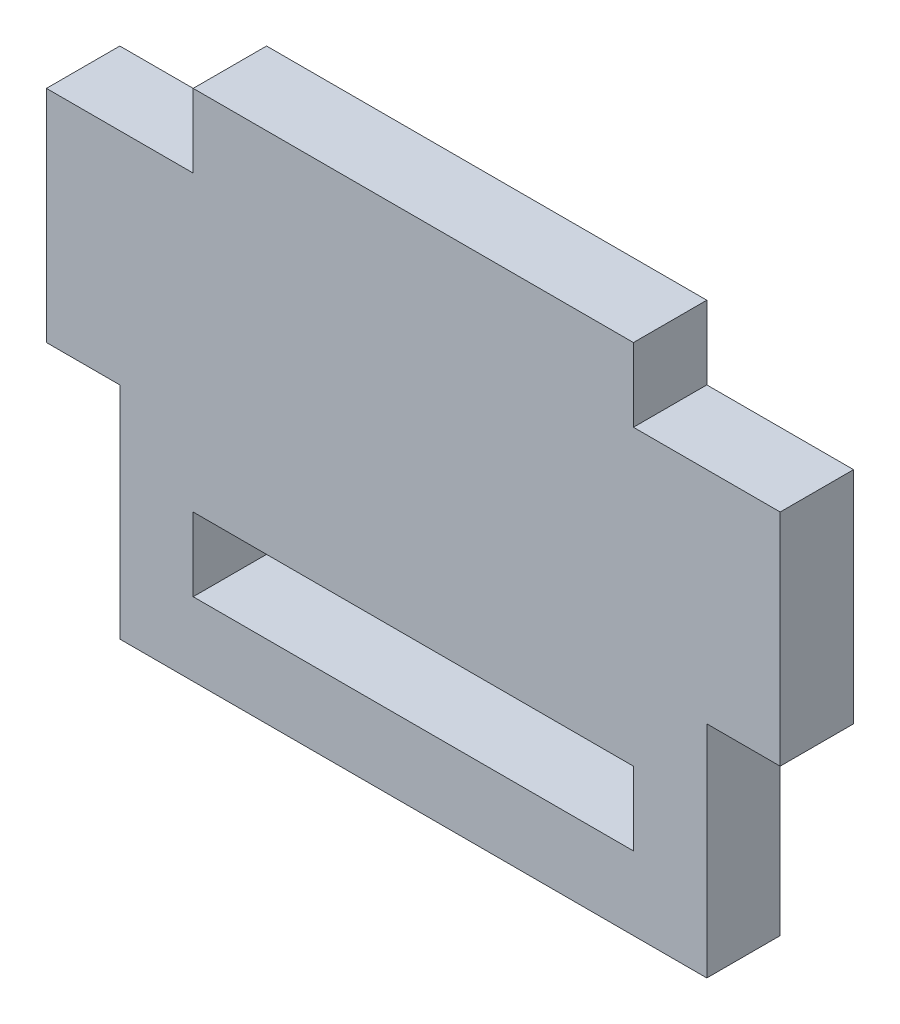
ISO-10303-21;
HEADER;
FILE_DESCRIPTION(('STEP AP214'),'2;1');
FILE_NAME('part.step','',(''),(''),'','','');
FILE_SCHEMA(('AUTOMOTIVE_DESIGN { 1 0 10303 214 1 1 1 1 }'));
ENDSEC;
DATA;
#1=APPLICATION_CONTEXT('core data for automotive mechanical design processes');
#2=APPLICATION_PROTOCOL_DEFINITION('international standard','automotive_design',2000,#1);
#3=PRODUCT_CONTEXT('',#1,'mechanical');
#4=PRODUCT('Part','Part','',(#3));
#5=PRODUCT_RELATED_PRODUCT_CATEGORY('part','',(#4));
#6=PRODUCT_DEFINITION_FORMATION('','',#4);
#7=PRODUCT_DEFINITION_CONTEXT('part definition',#1,'design');
#8=PRODUCT_DEFINITION('design','',#6,#7);
#9=PRODUCT_DEFINITION_SHAPE('','',#8);
#10=(LENGTH_UNIT() NAMED_UNIT(*) SI_UNIT(.MILLI.,.METRE.));
#11=(NAMED_UNIT(*) PLANE_ANGLE_UNIT() SI_UNIT($,.RADIAN.));
#12=(NAMED_UNIT(*) SI_UNIT($,.STERADIAN.) SOLID_ANGLE_UNIT());
#13=UNCERTAINTY_MEASURE_WITH_UNIT(LENGTH_MEASURE(1.E-05),#10,'distance_accuracy_value','');
#14=(GEOMETRIC_REPRESENTATION_CONTEXT(3) GLOBAL_UNCERTAINTY_ASSIGNED_CONTEXT((#13)) GLOBAL_UNIT_ASSIGNED_CONTEXT((#10,
#11,#12)) REPRESENTATION_CONTEXT('',''));
#15=CARTESIAN_POINT('',(0.,0.,0.));
#16=DIRECTION('',(0.,0.,1.));
#17=DIRECTION('',(1.,0.,0.));
#18=AXIS2_PLACEMENT_3D('',#15,#16,#17);
#19=CARTESIAN_POINT('',(0.,-20.,5.));
#20=DIRECTION('',(0.,1.,0.));
#21=DIRECTION('',(0.,0.,1.));
#22=AXIS2_PLACEMENT_3D('',#19,#20,#21);
#23=PLANE('',#22);
#24=DIRECTION('',(1.,0.,0.));
#25=VECTOR('',#24,1.);
#26=CARTESIAN_POINT('',(0.,-20.,0.));
#27=LINE('',#26,#25);
#28=CARTESIAN_POINT('',(10.,-20.,0.));
#29=VERTEX_POINT('',#28);
#30=CARTESIAN_POINT('',(40.,-20.,0.));
#31=VERTEX_POINT('',#30);
#32=EDGE_CURVE('E207',#29,#31,#27,.T.);
#33=ORIENTED_EDGE('',*,*,#32,.T.);
#34=DIRECTION('',(0.,0.,-1.));
#35=VECTOR('',#34,1.);
#36=CARTESIAN_POINT('',(40.,-20.,5.));
#37=LINE('',#36,#35);
#38=CARTESIAN_POINT('',(40.,-20.,5.));
#39=VERTEX_POINT('',#38);
#40=EDGE_CURVE('E11',#39,#31,#37,.T.);
#41=ORIENTED_EDGE('',*,*,#40,.F.);
#42=DIRECTION('',(1.,0.,0.));
#43=VECTOR('',#42,1.);
#44=CARTESIAN_POINT('',(0.,-20.,5.));
#45=LINE('',#44,#43);
#46=CARTESIAN_POINT('',(10.,-20.,5.));
#47=VERTEX_POINT('',#46);
#48=EDGE_CURVE('E161',#47,#39,#45,.T.);
#49=ORIENTED_EDGE('',*,*,#48,.F.);
#50=DIRECTION('',(0.,0.,-1.));
#51=VECTOR('',#50,1.);
#52=CARTESIAN_POINT('',(10.,-20.,5.));
#53=LINE('',#52,#51);
#54=EDGE_CURVE('E53',#47,#29,#53,.T.);
#55=ORIENTED_EDGE('',*,*,#54,.T.);
#56=EDGE_LOOP('',(#33,#41,#49,#55));
#57=FACE_BOUND('',#56,.T.);
#58=ADVANCED_FACE('F34',(#57),#23,.F.);
#59=CARTESIAN_POINT('',(40.,0.,5.));
#60=DIRECTION('',(1.,0.,0.));
#61=DIRECTION('',(0.,0.,-1.));
#62=AXIS2_PLACEMENT_3D('',#59,#60,#61);
#63=PLANE('',#62);
#64=DIRECTION('',(0.,-1.,0.));
#65=VECTOR('',#64,1.);
#66=CARTESIAN_POINT('',(40.,0.,0.));
#67=LINE('',#66,#65);
#68=CARTESIAN_POINT('',(40.,-25.,0.));
#69=VERTEX_POINT('',#68);
#70=EDGE_CURVE('E167',#31,#69,#67,.T.);
#71=ORIENTED_EDGE('',*,*,#70,.T.);
#72=DIRECTION('',(0.,0.,-1.));
#73=VECTOR('',#72,1.);
#74=CARTESIAN_POINT('',(40.,-25.,5.));
#75=LINE('',#74,#73);
#76=CARTESIAN_POINT('',(40.,-25.,5.));
#77=VERTEX_POINT('',#76);
#78=EDGE_CURVE('E44',#77,#69,#75,.T.);
#79=ORIENTED_EDGE('',*,*,#78,.F.);
#80=DIRECTION('',(0.,-1.,0.));
#81=VECTOR('',#80,1.);
#82=CARTESIAN_POINT('',(40.,0.,5.));
#83=LINE('',#82,#81);
#84=EDGE_CURVE('E155',#39,#77,#83,.T.);
#85=ORIENTED_EDGE('',*,*,#84,.F.);
#86=ORIENTED_EDGE('',*,*,#40,.T.);
#87=EDGE_LOOP('',(#71,#79,#85,#86));
#88=FACE_BOUND('',#87,.T.);
#89=ADVANCED_FACE('F166',(#88),#63,.F.);
#90=CARTESIAN_POINT('',(0.,-25.,5.));
#91=DIRECTION('',(0.,1.,0.));
#92=DIRECTION('',(-1.,0.,0.));
#93=AXIS2_PLACEMENT_3D('',#90,#91,#92);
#94=PLANE('',#93);
#95=DIRECTION('',(1.,0.,0.));
#96=VECTOR('',#95,1.);
#97=CARTESIAN_POINT('',(0.,-25.,0.));
#98=LINE('',#97,#96);
#99=CARTESIAN_POINT('',(10.,-25.,0.));
#100=VERTEX_POINT('',#99);
#101=EDGE_CURVE('E210',#100,#69,#98,.T.);
#102=ORIENTED_EDGE('',*,*,#101,.F.);
#103=DIRECTION('',(0.,0.,-1.));
#104=VECTOR('',#103,1.);
#105=CARTESIAN_POINT('',(10.,-25.,5.));
#106=LINE('',#105,#104);
#107=CARTESIAN_POINT('',(10.,-25.,5.));
#108=VERTEX_POINT('',#107);
#109=EDGE_CURVE('E103',#108,#100,#106,.T.);
#110=ORIENTED_EDGE('',*,*,#109,.F.);
#111=DIRECTION('',(1.,0.,0.));
#112=VECTOR('',#111,1.);
#113=CARTESIAN_POINT('',(0.,-25.,5.));
#114=LINE('',#113,#112);
#115=EDGE_CURVE('E160',#108,#77,#114,.T.);
#116=ORIENTED_EDGE('',*,*,#115,.T.);
#117=ORIENTED_EDGE('',*,*,#78,.T.);
#118=EDGE_LOOP('',(#102,#110,#116,#117));
#119=FACE_BOUND('',#118,.T.);
#120=ADVANCED_FACE('F171',(#119),#94,.T.);
#121=CARTESIAN_POINT('',(10.,0.,5.));
#122=DIRECTION('',(-1.,0.,0.));
#123=DIRECTION('',(0.,-1.,0.));
#124=AXIS2_PLACEMENT_3D('',#121,#122,#123);
#125=PLANE('',#124);
#126=DIRECTION('',(0.,1.,0.));
#127=VECTOR('',#126,1.);
#128=CARTESIAN_POINT('',(10.,0.,0.));
#129=LINE('',#128,#127);
#130=CARTESIAN_POINT('',(10.,0.,0.));
#131=VERTEX_POINT('',#130);
#132=CARTESIAN_POINT('',(10.,5.,0.));
#133=VERTEX_POINT('',#132);
#134=EDGE_CURVE('E178',#131,#133,#129,.T.);
#135=ORIENTED_EDGE('',*,*,#134,.F.);
#136=DIRECTION('',(0.,0.,-1.));
#137=VECTOR('',#136,1.);
#138=CARTESIAN_POINT('',(10.,0.,5.));
#139=LINE('',#138,#137);
#140=CARTESIAN_POINT('',(10.,0.,5.));
#141=VERTEX_POINT('',#140);
#142=EDGE_CURVE('E38',#141,#131,#139,.T.);
#143=ORIENTED_EDGE('',*,*,#142,.F.);
#144=DIRECTION('',(0.,1.,0.));
#145=VECTOR('',#144,1.);
#146=CARTESIAN_POINT('',(10.,0.,5.));
#147=LINE('',#146,#145);
#148=CARTESIAN_POINT('',(10.,5.,5.));
#149=VERTEX_POINT('',#148);
#150=EDGE_CURVE('E215',#141,#149,#147,.T.);
#151=ORIENTED_EDGE('',*,*,#150,.T.);
#152=DIRECTION('',(0.,0.,-1.));
#153=VECTOR('',#152,1.);
#154=CARTESIAN_POINT('',(10.,5.,5.));
#155=LINE('',#154,#153);
#156=EDGE_CURVE('E174',#149,#133,#155,.T.);
#157=ORIENTED_EDGE('',*,*,#156,.T.);
#158=EDGE_LOOP('',(#135,#143,#151,#157));
#159=FACE_BOUND('',#158,.T.);
#160=ADVANCED_FACE('F36',(#159),#125,.T.);
#161=CARTESIAN_POINT('',(0.,0.,5.));
#162=DIRECTION('',(0.,1.,0.));
#163=DIRECTION('',(-1.,0.,0.));
#164=AXIS2_PLACEMENT_3D('',#161,#162,#163);
#165=PLANE('',#164);
#166=DIRECTION('',(1.,0.,0.));
#167=VECTOR('',#166,1.);
#168=CARTESIAN_POINT('',(0.,0.,0.));
#169=LINE('',#168,#167);
#170=CARTESIAN_POINT('',(0.,0.,0.));
#171=VERTEX_POINT('',#170);
#172=EDGE_CURVE('E181',#171,#131,#169,.T.);
#173=ORIENTED_EDGE('',*,*,#172,.F.);
#174=DIRECTION('',(0.,0.,-1.));
#175=VECTOR('',#174,1.);
#176=CARTESIAN_POINT('',(0.,0.,5.));
#177=LINE('',#176,#175);
#178=CARTESIAN_POINT('',(0.,0.,5.));
#179=VERTEX_POINT('',#178);
#180=EDGE_CURVE('E239',#179,#171,#177,.T.);
#181=ORIENTED_EDGE('',*,*,#180,.F.);
#182=DIRECTION('',(1.,0.,0.));
#183=VECTOR('',#182,1.);
#184=CARTESIAN_POINT('',(0.,0.,5.));
#185=LINE('',#184,#183);
#186=EDGE_CURVE('E248',#179,#141,#185,.T.);
#187=ORIENTED_EDGE('',*,*,#186,.T.);
#188=ORIENTED_EDGE('',*,*,#142,.T.);
#189=EDGE_LOOP('',(#173,#181,#187,#188));
#190=FACE_BOUND('',#189,.T.);
#191=ADVANCED_FACE('F246',(#190),#165,.T.);
#192=CARTESIAN_POINT('',(0.,0.,5.));
#193=DIRECTION('',(1.,0.,0.));
#194=DIRECTION('',(0.,1.,0.));
#195=AXIS2_PLACEMENT_3D('',#192,#193,#194);
#196=PLANE('',#195);
#197=DIRECTION('',(0.,-1.,0.));
#198=VECTOR('',#197,1.);
#199=CARTESIAN_POINT('',(0.,0.,0.));
#200=LINE('',#199,#198);
#201=CARTESIAN_POINT('',(0.,-15.,0.));
#202=VERTEX_POINT('',#201);
#203=EDGE_CURVE('E184',#171,#202,#200,.T.);
#204=ORIENTED_EDGE('',*,*,#203,.T.);
#205=DIRECTION('',(0.,0.,-1.));
#206=VECTOR('',#205,1.);
#207=CARTESIAN_POINT('',(0.,-15.,5.));
#208=LINE('',#207,#206);
#209=CARTESIAN_POINT('',(0.,-15.,5.));
#210=VERTEX_POINT('',#209);
#211=EDGE_CURVE('E237',#210,#202,#208,.T.);
#212=ORIENTED_EDGE('',*,*,#211,.F.);
#213=DIRECTION('',(0.,-1.,0.));
#214=VECTOR('',#213,1.);
#215=CARTESIAN_POINT('',(0.,0.,5.));
#216=LINE('',#215,#214);
#217=EDGE_CURVE('E265',#179,#210,#216,.T.);
#218=ORIENTED_EDGE('',*,*,#217,.F.);
#219=ORIENTED_EDGE('',*,*,#180,.T.);
#220=EDGE_LOOP('',(#204,#212,#218,#219));
#221=FACE_BOUND('',#220,.T.);
#222=ADVANCED_FACE('F256',(#221),#196,.F.);
#223=CARTESIAN_POINT('',(0.,-15.,5.));
#224=DIRECTION('',(0.,1.,0.));
#225=DIRECTION('',(0.,0.,1.));
#226=AXIS2_PLACEMENT_3D('',#223,#224,#225);
#227=PLANE('',#226);
#228=DIRECTION('',(1.,0.,0.));
#229=VECTOR('',#228,1.);
#230=CARTESIAN_POINT('',(0.,-15.,0.));
#231=LINE('',#230,#229);
#232=CARTESIAN_POINT('',(5.00000000000001,-15.,0.));
#233=VERTEX_POINT('',#232);
#234=EDGE_CURVE('E187',#202,#233,#231,.T.);
#235=ORIENTED_EDGE('',*,*,#234,.T.);
#236=DIRECTION('',(0.,0.,-1.));
#237=VECTOR('',#236,1.);
#238=CARTESIAN_POINT('',(5.00000000000001,-15.,5.));
#239=LINE('',#238,#237);
#240=CARTESIAN_POINT('',(5.00000000000001,-15.,5.));
#241=VERTEX_POINT('',#240);
#242=EDGE_CURVE('E234',#241,#233,#239,.T.);
#243=ORIENTED_EDGE('',*,*,#242,.F.);
#244=DIRECTION('',(1.,0.,0.));
#245=VECTOR('',#244,1.);
#246=CARTESIAN_POINT('',(0.,-15.,5.));
#247=LINE('',#246,#245);
#248=EDGE_CURVE('E261',#210,#241,#247,.T.);
#249=ORIENTED_EDGE('',*,*,#248,.F.);
#250=ORIENTED_EDGE('',*,*,#211,.T.);
#251=EDGE_LOOP('',(#235,#243,#249,#250));
#252=FACE_BOUND('',#251,.T.);
#253=ADVANCED_FACE('F259',(#252),#227,.F.);
#254=CARTESIAN_POINT('',(5.,0.,5.));
#255=DIRECTION('',(1.,0.,0.));
#256=DIRECTION('',(0.,1.,0.));
#257=AXIS2_PLACEMENT_3D('',#254,#255,#256);
#258=PLANE('',#257);
#259=DIRECTION('',(0.,-1.,0.));
#260=VECTOR('',#259,1.);
#261=CARTESIAN_POINT('',(5.,0.,0.));
#262=LINE('',#261,#260);
#263=CARTESIAN_POINT('',(5.00000000000001,-30.,0.));
#264=VERTEX_POINT('',#263);
#265=EDGE_CURVE('E189',#233,#264,#262,.T.);
#266=ORIENTED_EDGE('',*,*,#265,.T.);
#267=DIRECTION('',(0.,0.,-1.));
#268=VECTOR('',#267,1.);
#269=CARTESIAN_POINT('',(5.00000000000001,-30.,5.));
#270=LINE('',#269,#268);
#271=CARTESIAN_POINT('',(5.00000000000001,-30.,5.));
#272=VERTEX_POINT('',#271);
#273=EDGE_CURVE('E231',#272,#264,#270,.T.);
#274=ORIENTED_EDGE('',*,*,#273,.F.);
#275=DIRECTION('',(0.,-1.,0.));
#276=VECTOR('',#275,1.);
#277=CARTESIAN_POINT('',(5.,0.,5.));
#278=LINE('',#277,#276);
#279=EDGE_CURVE('E264',#241,#272,#278,.T.);
#280=ORIENTED_EDGE('',*,*,#279,.F.);
#281=ORIENTED_EDGE('',*,*,#242,.T.);
#282=EDGE_LOOP('',(#266,#274,#280,#281));
#283=FACE_BOUND('',#282,.T.);
#284=ADVANCED_FACE('F318',(#283),#258,.F.);
#285=CARTESIAN_POINT('',(0.,-30.,5.));
#286=DIRECTION('',(0.,1.,0.));
#287=DIRECTION('',(0.,0.,1.));
#288=AXIS2_PLACEMENT_3D('',#285,#286,#287);
#289=PLANE('',#288);
#290=DIRECTION('',(1.,0.,0.));
#291=VECTOR('',#290,1.);
#292=CARTESIAN_POINT('',(0.,-30.,0.));
#293=LINE('',#292,#291);
#294=CARTESIAN_POINT('',(45.,-30.,0.));
#295=VERTEX_POINT('',#294);
#296=EDGE_CURVE('E192',#264,#295,#293,.T.);
#297=ORIENTED_EDGE('',*,*,#296,.T.);
#298=DIRECTION('',(0.,0.,-1.));
#299=VECTOR('',#298,1.);
#300=CARTESIAN_POINT('',(45.,-30.,5.));
#301=LINE('',#300,#299);
#302=CARTESIAN_POINT('',(45.,-30.,5.));
#303=VERTEX_POINT('',#302);
#304=EDGE_CURVE('E229',#303,#295,#301,.T.);
#305=ORIENTED_EDGE('',*,*,#304,.F.);
#306=DIRECTION('',(1.,0.,0.));
#307=VECTOR('',#306,1.);
#308=CARTESIAN_POINT('',(0.,-30.,5.));
#309=LINE('',#308,#307);
#310=EDGE_CURVE('E268',#272,#303,#309,.T.);
#311=ORIENTED_EDGE('',*,*,#310,.F.);
#312=ORIENTED_EDGE('',*,*,#273,.T.);
#313=EDGE_LOOP('',(#297,#305,#311,#312));
#314=FACE_BOUND('',#313,.T.);
#315=ADVANCED_FACE('F315',(#314),#289,.F.);
#316=CARTESIAN_POINT('',(45.,0.,5.));
#317=DIRECTION('',(1.,0.,0.));
#318=DIRECTION('',(0.,1.,0.));
#319=AXIS2_PLACEMENT_3D('',#316,#317,#318);
#320=PLANE('',#319);
#321=DIRECTION('',(0.,-1.,0.));
#322=VECTOR('',#321,1.);
#323=CARTESIAN_POINT('',(45.,0.,0.));
#324=LINE('',#323,#322);
#325=CARTESIAN_POINT('',(45.,-15.,0.));
#326=VERTEX_POINT('',#325);
#327=EDGE_CURVE('E195',#326,#295,#324,.T.);
#328=ORIENTED_EDGE('',*,*,#327,.F.);
#329=DIRECTION('',(0.,0.,-1.));
#330=VECTOR('',#329,1.);
#331=CARTESIAN_POINT('',(45.,-15.,5.));
#332=LINE('',#331,#330);
#333=CARTESIAN_POINT('',(45.,-15.,5.));
#334=VERTEX_POINT('',#333);
#335=EDGE_CURVE('E227',#334,#326,#332,.T.);
#336=ORIENTED_EDGE('',*,*,#335,.F.);
#337=DIRECTION('',(0.,-1.,0.));
#338=VECTOR('',#337,1.);
#339=CARTESIAN_POINT('',(45.,0.,5.));
#340=LINE('',#339,#338);
#341=EDGE_CURVE('E272',#334,#303,#340,.T.);
#342=ORIENTED_EDGE('',*,*,#341,.T.);
#343=ORIENTED_EDGE('',*,*,#304,.T.);
#344=EDGE_LOOP('',(#328,#336,#342,#343));
#345=FACE_BOUND('',#344,.T.);
#346=ADVANCED_FACE('F311',(#345),#320,.T.);
#347=CARTESIAN_POINT('',(50.,-15.,0.));
#348=VERTEX_POINT('',#347);
#349=EDGE_CURVE('E190',#326,#348,#231,.T.);
#350=ORIENTED_EDGE('',*,*,#349,.T.);
#351=DIRECTION('',(0.,0.,-1.));
#352=VECTOR('',#351,1.);
#353=CARTESIAN_POINT('',(50.,-15.,5.));
#354=LINE('',#353,#352);
#355=CARTESIAN_POINT('',(50.,-15.,5.));
#356=VERTEX_POINT('',#355);
#357=EDGE_CURVE('E225',#356,#348,#354,.T.);
#358=ORIENTED_EDGE('',*,*,#357,.F.);
#359=EDGE_CURVE('E267',#334,#356,#247,.T.);
#360=ORIENTED_EDGE('',*,*,#359,.F.);
#361=ORIENTED_EDGE('',*,*,#335,.T.);
#362=EDGE_LOOP('',(#350,#358,#360,#361));
#363=FACE_BOUND('',#362,.T.);
#364=ADVANCED_FACE('F327',(#363),#227,.F.);
#365=CARTESIAN_POINT('',(50.,0.,5.));
#366=DIRECTION('',(1.,0.,0.));
#367=DIRECTION('',(0.,1.,0.));
#368=AXIS2_PLACEMENT_3D('',#365,#366,#367);
#369=PLANE('',#368);
#370=DIRECTION('',(0.,-1.,0.));
#371=VECTOR('',#370,1.);
#372=CARTESIAN_POINT('',(50.,0.,0.));
#373=LINE('',#372,#371);
#374=CARTESIAN_POINT('',(50.,0.,0.));
#375=VERTEX_POINT('',#374);
#376=EDGE_CURVE('E198',#375,#348,#373,.T.);
#377=ORIENTED_EDGE('',*,*,#376,.F.);
#378=DIRECTION('',(0.,0.,-1.));
#379=VECTOR('',#378,1.);
#380=CARTESIAN_POINT('',(50.,0.,5.));
#381=LINE('',#380,#379);
#382=CARTESIAN_POINT('',(50.,0.,5.));
#383=VERTEX_POINT('',#382);
#384=EDGE_CURVE('E223',#383,#375,#381,.T.);
#385=ORIENTED_EDGE('',*,*,#384,.F.);
#386=DIRECTION('',(0.,-1.,0.));
#387=VECTOR('',#386,1.);
#388=CARTESIAN_POINT('',(50.,0.,5.));
#389=LINE('',#388,#387);
#390=EDGE_CURVE('E271',#383,#356,#389,.T.);
#391=ORIENTED_EDGE('',*,*,#390,.T.);
#392=ORIENTED_EDGE('',*,*,#357,.T.);
#393=EDGE_LOOP('',(#377,#385,#391,#392));
#394=FACE_BOUND('',#393,.T.);
#395=ADVANCED_FACE('F305',(#394),#369,.T.);
#396=CARTESIAN_POINT('',(40.,0.,0.));
#397=VERTEX_POINT('',#396);
#398=EDGE_CURVE('E185',#397,#375,#169,.T.);
#399=ORIENTED_EDGE('',*,*,#398,.F.);
#400=DIRECTION('',(0.,0.,-1.));
#401=VECTOR('',#400,1.);
#402=CARTESIAN_POINT('',(40.,0.,5.));
#403=LINE('',#402,#401);
#404=CARTESIAN_POINT('',(40.,0.,5.));
#405=VERTEX_POINT('',#404);
#406=EDGE_CURVE('E221',#405,#397,#403,.T.);
#407=ORIENTED_EDGE('',*,*,#406,.F.);
#408=EDGE_CURVE('E278',#405,#383,#185,.T.);
#409=ORIENTED_EDGE('',*,*,#408,.T.);
#410=ORIENTED_EDGE('',*,*,#384,.T.);
#411=EDGE_LOOP('',(#399,#407,#409,#410));
#412=FACE_BOUND('',#411,.T.);
#413=ADVANCED_FACE('F302',(#412),#165,.T.);
#414=CARTESIAN_POINT('',(40.,1.11022302462516E-13,5.));
#415=DIRECTION('',(-1.,0.,0.));
#416=DIRECTION('',(0.,-1.,0.));
#417=AXIS2_PLACEMENT_3D('',#414,#415,#416);
#418=PLANE('',#417);
#419=DIRECTION('',(0.,1.,0.));
#420=VECTOR('',#419,1.);
#421=CARTESIAN_POINT('',(40.,1.11022302462516E-13,0.));
#422=LINE('',#421,#420);
#423=CARTESIAN_POINT('',(40.,5.,0.));
#424=VERTEX_POINT('',#423);
#425=EDGE_CURVE('E201',#397,#424,#422,.T.);
#426=ORIENTED_EDGE('',*,*,#425,.T.);
#427=DIRECTION('',(0.,0.,-1.));
#428=VECTOR('',#427,1.);
#429=CARTESIAN_POINT('',(40.,5.,5.));
#430=LINE('',#429,#428);
#431=CARTESIAN_POINT('',(40.,5.,5.));
#432=VERTEX_POINT('',#431);
#433=EDGE_CURVE('E219',#432,#424,#430,.T.);
#434=ORIENTED_EDGE('',*,*,#433,.F.);
#435=DIRECTION('',(0.,1.,0.));
#436=VECTOR('',#435,1.);
#437=CARTESIAN_POINT('',(40.,1.11022302462516E-13,5.));
#438=LINE('',#437,#436);
#439=EDGE_CURVE('E285',#405,#432,#438,.T.);
#440=ORIENTED_EDGE('',*,*,#439,.F.);
#441=ORIENTED_EDGE('',*,*,#406,.T.);
#442=EDGE_LOOP('',(#426,#434,#440,#441));
#443=FACE_BOUND('',#442,.T.);
#444=ADVANCED_FACE('F297',(#443),#418,.F.);
#445=CARTESIAN_POINT('',(0.,5.,5.));
#446=DIRECTION('',(0.,1.,0.));
#447=DIRECTION('',(0.,0.,1.));
#448=AXIS2_PLACEMENT_3D('',#445,#446,#447);
#449=PLANE('',#448);
#450=DIRECTION('',(1.,0.,0.));
#451=VECTOR('',#450,1.);
#452=CARTESIAN_POINT('',(0.,5.,0.));
#453=LINE('',#452,#451);
#454=EDGE_CURVE('E204',#133,#424,#453,.T.);
#455=ORIENTED_EDGE('',*,*,#454,.F.);
#456=ORIENTED_EDGE('',*,*,#156,.F.);
#457=DIRECTION('',(1.,0.,0.));
#458=VECTOR('',#457,1.);
#459=CARTESIAN_POINT('',(0.,5.,5.));
#460=LINE('',#459,#458);
#461=EDGE_CURVE('E287',#149,#432,#460,.T.);
#462=ORIENTED_EDGE('',*,*,#461,.T.);
#463=ORIENTED_EDGE('',*,*,#433,.T.);
#464=EDGE_LOOP('',(#455,#456,#462,#463));
#465=FACE_BOUND('',#464,.T.);
#466=ADVANCED_FACE('F291',(#465),#449,.T.);
#467=CARTESIAN_POINT('',(10.,0.,5.));
#468=DIRECTION('',(1.,0.,0.));
#469=DIRECTION('',(0.,1.,0.));
#470=AXIS2_PLACEMENT_3D('',#467,#468,#469);
#471=PLANE('',#470);
#472=DIRECTION('',(0.,-1.,0.));
#473=VECTOR('',#472,1.);
#474=CARTESIAN_POINT('',(10.,0.,0.));
#475=LINE('',#474,#473);
#476=EDGE_CURVE('E212',#29,#100,#475,.T.);
#477=ORIENTED_EDGE('',*,*,#476,.F.);
#478=ORIENTED_EDGE('',*,*,#54,.F.);
#479=DIRECTION('',(0.,-1.,0.));
#480=VECTOR('',#479,1.);
#481=CARTESIAN_POINT('',(10.,0.,5.));
#482=LINE('',#481,#480);
#483=EDGE_CURVE('E172',#47,#108,#482,.T.);
#484=ORIENTED_EDGE('',*,*,#483,.T.);
#485=ORIENTED_EDGE('',*,*,#109,.T.);
#486=EDGE_LOOP('',(#477,#478,#484,#485));
#487=FACE_BOUND('',#486,.T.);
#488=ADVANCED_FACE('F338',(#487),#471,.T.);
#489=CARTESIAN_POINT('',(0.,0.,5.));
#490=DIRECTION('',(0.,0.,1.));
#491=DIRECTION('',(1.,0.,0.));
#492=AXIS2_PLACEMENT_3D('',#489,#490,#491);
#493=PLANE('',#492);
#494=ORIENTED_EDGE('',*,*,#150,.F.);
#495=ORIENTED_EDGE('',*,*,#186,.F.);
#496=ORIENTED_EDGE('',*,*,#217,.T.);
#497=ORIENTED_EDGE('',*,*,#248,.T.);
#498=ORIENTED_EDGE('',*,*,#279,.T.);
#499=ORIENTED_EDGE('',*,*,#310,.T.);
#500=ORIENTED_EDGE('',*,*,#341,.F.);
#501=ORIENTED_EDGE('',*,*,#359,.T.);
#502=ORIENTED_EDGE('',*,*,#390,.F.);
#503=ORIENTED_EDGE('',*,*,#408,.F.);
#504=ORIENTED_EDGE('',*,*,#439,.T.);
#505=ORIENTED_EDGE('',*,*,#461,.F.);
#506=EDGE_LOOP('',(#494,#495,#496,#497,#498,#499,#500,#501,#502,#503,#504,#505));
#507=FACE_BOUND('',#506,.T.);
#508=ORIENTED_EDGE('',*,*,#48,.T.);
#509=ORIENTED_EDGE('',*,*,#84,.T.);
#510=ORIENTED_EDGE('',*,*,#115,.F.);
#511=ORIENTED_EDGE('',*,*,#483,.F.);
#512=EDGE_LOOP('',(#508,#509,#510,#511));
#513=FACE_BOUND('',#512,.T.);
#514=ADVANCED_FACE('F157',(#507,#513),#493,.T.);
#515=CARTESIAN_POINT('',(0.,0.,0.));
#516=DIRECTION('',(0.,0.,1.));
#517=DIRECTION('',(1.,0.,0.));
#518=AXIS2_PLACEMENT_3D('',#515,#516,#517);
#519=PLANE('',#518);
#520=ORIENTED_EDGE('',*,*,#134,.T.);
#521=ORIENTED_EDGE('',*,*,#454,.T.);
#522=ORIENTED_EDGE('',*,*,#425,.F.);
#523=ORIENTED_EDGE('',*,*,#398,.T.);
#524=ORIENTED_EDGE('',*,*,#376,.T.);
#525=ORIENTED_EDGE('',*,*,#349,.F.);
#526=ORIENTED_EDGE('',*,*,#327,.T.);
#527=ORIENTED_EDGE('',*,*,#296,.F.);
#528=ORIENTED_EDGE('',*,*,#265,.F.);
#529=ORIENTED_EDGE('',*,*,#234,.F.);
#530=ORIENTED_EDGE('',*,*,#203,.F.);
#531=ORIENTED_EDGE('',*,*,#172,.T.);
#532=EDGE_LOOP('',(#520,#521,#522,#523,#524,#525,#526,#527,#528,#529,#530,#531));
#533=FACE_BOUND('',#532,.T.);
#534=ORIENTED_EDGE('',*,*,#32,.F.);
#535=ORIENTED_EDGE('',*,*,#476,.T.);
#536=ORIENTED_EDGE('',*,*,#101,.T.);
#537=ORIENTED_EDGE('',*,*,#70,.F.);
#538=EDGE_LOOP('',(#534,#535,#536,#537));
#539=FACE_BOUND('',#538,.T.);
#540=ADVANCED_FACE('F251',(#533,#539),#519,.F.);
#541=CLOSED_SHELL('',(#58,#89,#120,#160,#191,#222,#253,#284,#315,#346,#364,#395,#413,#444,#466,
#488,#514,#540));
#542=MANIFOLD_SOLID_BREP('B2',#541);
#543=ADVANCED_BREP_SHAPE_REPRESENTATION('',(#18,#542),#14);
#544=SHAPE_DEFINITION_REPRESENTATION(#9,#543);
ENDSEC;
END-ISO-10303-21;
